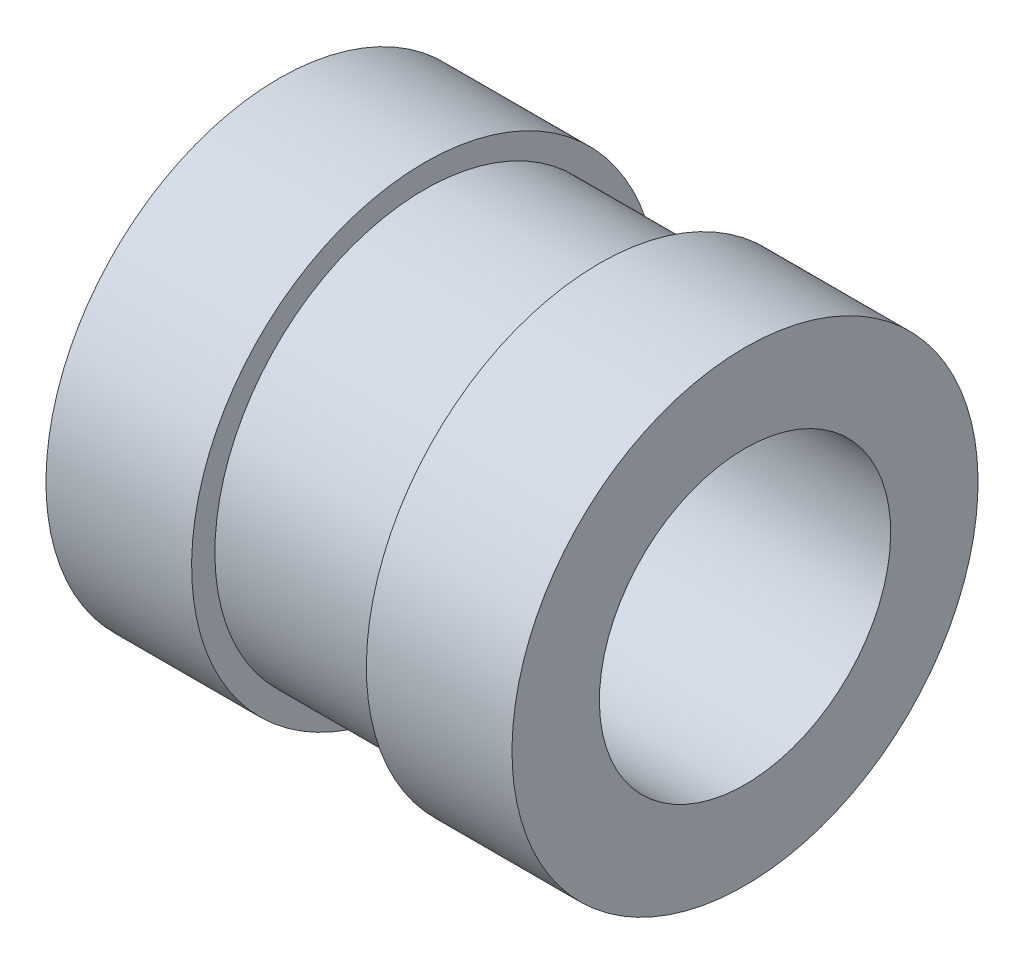
ISO-10303-21;
HEADER;
FILE_DESCRIPTION(('STEP AP214'),'2;1');
FILE_NAME('part.step','',(''),(''),'','','');
FILE_SCHEMA(('AUTOMOTIVE_DESIGN { 1 0 10303 214 1 1 1 1 }'));
ENDSEC;
DATA;
#1=APPLICATION_CONTEXT('core data for automotive mechanical design processes');
#2=APPLICATION_PROTOCOL_DEFINITION('international standard','automotive_design',2000,#1);
#3=PRODUCT_CONTEXT('',#1,'mechanical');
#4=PRODUCT('Part','Part','',(#3));
#5=PRODUCT_RELATED_PRODUCT_CATEGORY('part','',(#4));
#6=PRODUCT_DEFINITION_FORMATION('','',#4);
#7=PRODUCT_DEFINITION_CONTEXT('part definition',#1,'design');
#8=PRODUCT_DEFINITION('design','',#6,#7);
#9=PRODUCT_DEFINITION_SHAPE('','',#8);
#10=(LENGTH_UNIT() NAMED_UNIT(*) SI_UNIT(.MILLI.,.METRE.));
#11=(NAMED_UNIT(*) PLANE_ANGLE_UNIT() SI_UNIT($,.RADIAN.));
#12=(NAMED_UNIT(*) SI_UNIT($,.STERADIAN.) SOLID_ANGLE_UNIT());
#13=UNCERTAINTY_MEASURE_WITH_UNIT(LENGTH_MEASURE(1.E-05),#10,'distance_accuracy_value','');
#14=(GEOMETRIC_REPRESENTATION_CONTEXT(3) GLOBAL_UNCERTAINTY_ASSIGNED_CONTEXT((#13)) GLOBAL_UNIT_ASSIGNED_CONTEXT((#10,
#11,#12)) REPRESENTATION_CONTEXT('',''));
#15=CARTESIAN_POINT('',(0.,0.,0.));
#16=DIRECTION('',(0.,0.,1.));
#17=DIRECTION('',(1.,0.,0.));
#18=AXIS2_PLACEMENT_3D('',#15,#16,#17);
#19=CARTESIAN_POINT('',(9.62704679735164,39.9670130886636,125.728955153829));
#20=DIRECTION('',(-1.,0.,0.));
#21=DIRECTION('',(0.,-1.,0.));
#22=AXIS2_PLACEMENT_3D('',#19,#20,#21);
#23=CYLINDRICAL_SURFACE('',#22,1.8);
#24=CARTESIAN_POINT('',(12.3770467973516,39.9670130886636,125.728955153829));
#25=DIRECTION('',(-1.,0.,0.));
#26=DIRECTION('',(0.,-1.,0.));
#27=AXIS2_PLACEMENT_3D('',#24,#25,#26);
#28=CIRCLE('',#27,1.8);
#29=CARTESIAN_POINT('',(12.3770467973516,38.1670130886637,125.728955153829));
#30=VERTEX_POINT('',#29);
#31=EDGE_CURVE('E18',#30,#30,#28,.T.);
#32=ORIENTED_EDGE('',*,*,#31,.T.);
#33=EDGE_LOOP('',(#32));
#34=FACE_BOUND('',#33,.T.);
#35=CARTESIAN_POINT('',(10.8770467973516,39.9670130886636,125.728955153829));
#36=DIRECTION('',(-1.,0.,0.));
#37=DIRECTION('',(0.,-1.,0.));
#38=AXIS2_PLACEMENT_3D('',#35,#36,#37);
#39=CIRCLE('',#38,1.8);
#40=CARTESIAN_POINT('',(10.8770467973516,38.1670130886637,125.728955153829));
#41=VERTEX_POINT('',#40);
#42=EDGE_CURVE('E40',#41,#41,#39,.F.);
#43=ORIENTED_EDGE('',*,*,#42,.T.);
#44=EDGE_LOOP('',(#43));
#45=FACE_BOUND('',#44,.T.);
#46=ADVANCED_FACE('F15',(#34,#45),#23,.T.);
#47=CARTESIAN_POINT('',(12.3770467973516,37.9670130886636,125.728955153829));
#48=DIRECTION('',(1.,0.,0.));
#49=DIRECTION('',(0.,1.,0.));
#50=AXIS2_PLACEMENT_3D('',#47,#48,#49);
#51=PLANE('',#50);
#52=ORIENTED_EDGE('',*,*,#31,.F.);
#53=EDGE_LOOP('',(#52));
#54=FACE_BOUND('',#53,.T.);
#55=CARTESIAN_POINT('',(12.3770467973516,39.9670130886636,125.728955153829));
#56=DIRECTION('',(1.,0.,0.));
#57=DIRECTION('',(0.,1.,0.));
#58=AXIS2_PLACEMENT_3D('',#55,#56,#57);
#59=CIRCLE('',#58,2.);
#60=CARTESIAN_POINT('',(12.3770467973516,41.9670130886636,125.728955153829));
#61=VERTEX_POINT('',#60);
#62=EDGE_CURVE('E38',#61,#61,#59,.T.);
#63=ORIENTED_EDGE('',*,*,#62,.F.);
#64=EDGE_LOOP('',(#63));
#65=FACE_BOUND('',#64,.T.);
#66=ADVANCED_FACE('F48',(#54,#65),#51,.F.);
#67=CARTESIAN_POINT('',(10.8770467973516,37.9670130886636,125.728955153829));
#68=DIRECTION('',(-1.,0.,0.));
#69=DIRECTION('',(0.,-1.,0.));
#70=AXIS2_PLACEMENT_3D('',#67,#68,#69);
#71=PLANE('',#70);
#72=CARTESIAN_POINT('',(10.8770467973516,39.9670130886636,125.728955153829));
#73=DIRECTION('',(1.,0.,0.));
#74=DIRECTION('',(0.,1.,0.));
#75=AXIS2_PLACEMENT_3D('',#72,#73,#74);
#76=CIRCLE('',#75,2.);
#77=CARTESIAN_POINT('',(10.8770467973516,41.9670130886636,125.728955153829));
#78=VERTEX_POINT('',#77);
#79=EDGE_CURVE('E35',#78,#78,#76,.F.);
#80=ORIENTED_EDGE('',*,*,#79,.F.);
#81=EDGE_LOOP('',(#80));
#82=FACE_BOUND('',#81,.T.);
#83=ORIENTED_EDGE('',*,*,#42,.F.);
#84=EDGE_LOOP('',(#83));
#85=FACE_BOUND('',#84,.T.);
#86=ADVANCED_FACE('F51',(#82,#85),#71,.F.);
#87=CARTESIAN_POINT('',(9.62704679735164,39.9670130886636,125.728955153829));
#88=DIRECTION('',(1.,0.,0.));
#89=DIRECTION('',(0.,1.,0.));
#90=AXIS2_PLACEMENT_3D('',#87,#88,#89);
#91=CYLINDRICAL_SURFACE('',#90,2.);
#92=ORIENTED_EDGE('',*,*,#62,.T.);
#93=EDGE_LOOP('',(#92));
#94=FACE_BOUND('',#93,.T.);
#95=CARTESIAN_POINT('',(13.6270467973516,39.9670130886636,125.728955153829));
#96=DIRECTION('',(1.,0.,0.));
#97=DIRECTION('',(0.,1.,0.));
#98=AXIS2_PLACEMENT_3D('',#95,#96,#97);
#99=CIRCLE('',#98,2.);
#100=CARTESIAN_POINT('',(13.6270467973516,41.9670130886636,125.728955153829));
#101=VERTEX_POINT('',#100);
#102=EDGE_CURVE('E32',#101,#101,#99,.F.);
#103=ORIENTED_EDGE('',*,*,#102,.T.);
#104=EDGE_LOOP('',(#103));
#105=FACE_BOUND('',#104,.T.);
#106=ADVANCED_FACE('F54',(#94,#105),#91,.T.);
#107=CARTESIAN_POINT('',(9.62704679735164,39.9670130886636,125.728955153829));
#108=DIRECTION('',(1.,0.,0.));
#109=DIRECTION('',(0.,1.,0.));
#110=AXIS2_PLACEMENT_3D('',#107,#108,#109);
#111=CYLINDRICAL_SURFACE('',#110,2.);
#112=ORIENTED_EDGE('',*,*,#79,.T.);
#113=EDGE_LOOP('',(#112));
#114=FACE_BOUND('',#113,.T.);
#115=CARTESIAN_POINT('',(9.62704679735164,39.9670130886636,125.728955153829));
#116=DIRECTION('',(1.,0.,0.));
#117=DIRECTION('',(0.,1.,0.));
#118=AXIS2_PLACEMENT_3D('',#115,#116,#117);
#119=CIRCLE('',#118,2.);
#120=CARTESIAN_POINT('',(9.62704679735164,41.9670130886636,125.728955153829));
#121=VERTEX_POINT('',#120);
#122=EDGE_CURVE('E27',#121,#121,#119,.F.);
#123=ORIENTED_EDGE('',*,*,#122,.F.);
#124=EDGE_LOOP('',(#123));
#125=FACE_BOUND('',#124,.T.);
#126=ADVANCED_FACE('F57',(#114,#125),#111,.T.);
#127=CARTESIAN_POINT('',(13.6270467973516,39.9670130886636,125.728955153829));
#128=DIRECTION('',(-1.,0.,0.));
#129=DIRECTION('',(0.,-1.,0.));
#130=AXIS2_PLACEMENT_3D('',#127,#128,#129);
#131=PLANE('',#130);
#132=ORIENTED_EDGE('',*,*,#102,.F.);
#133=EDGE_LOOP('',(#132));
#134=FACE_BOUND('',#133,.T.);
#135=CARTESIAN_POINT('',(13.6270467973516,39.9670130886636,125.728955153829));
#136=DIRECTION('',(1.,0.,0.));
#137=DIRECTION('',(0.,1.,0.));
#138=AXIS2_PLACEMENT_3D('',#135,#136,#137);
#139=CIRCLE('',#138,1.25);
#140=CARTESIAN_POINT('',(13.6270467973516,41.2170130886636,125.728955153829));
#141=VERTEX_POINT('',#140);
#142=EDGE_CURVE('E22',#141,#141,#139,.F.);
#143=ORIENTED_EDGE('',*,*,#142,.T.);
#144=EDGE_LOOP('',(#143));
#145=FACE_BOUND('',#144,.T.);
#146=ADVANCED_FACE('F61',(#134,#145),#131,.F.);
#147=CARTESIAN_POINT('',(9.62704679735164,39.9670130886636,125.728955153829));
#148=DIRECTION('',(-1.,0.,0.));
#149=DIRECTION('',(0.,-1.,0.));
#150=AXIS2_PLACEMENT_3D('',#147,#148,#149);
#151=PLANE('',#150);
#152=ORIENTED_EDGE('',*,*,#122,.T.);
#153=EDGE_LOOP('',(#152));
#154=FACE_BOUND('',#153,.T.);
#155=CARTESIAN_POINT('',(9.62704679735164,39.9670130886636,125.728955153829));
#156=DIRECTION('',(1.,0.,0.));
#157=DIRECTION('',(0.,1.,0.));
#158=AXIS2_PLACEMENT_3D('',#155,#156,#157);
#159=CIRCLE('',#158,1.25);
#160=CARTESIAN_POINT('',(9.62704679735164,41.2170130886636,125.728955153829));
#161=VERTEX_POINT('',#160);
#162=EDGE_CURVE('E10',#161,#161,#159,.T.);
#163=ORIENTED_EDGE('',*,*,#162,.T.);
#164=EDGE_LOOP('',(#163));
#165=FACE_BOUND('',#164,.T.);
#166=ADVANCED_FACE('F64',(#154,#165),#151,.T.);
#167=CARTESIAN_POINT('',(9.62704679735164,39.9670130886636,125.728955153829));
#168=DIRECTION('',(1.,0.,0.));
#169=DIRECTION('',(0.,1.,0.));
#170=AXIS2_PLACEMENT_3D('',#167,#168,#169);
#171=CYLINDRICAL_SURFACE('',#170,1.25);
#172=ORIENTED_EDGE('',*,*,#162,.F.);
#173=EDGE_LOOP('',(#172));
#174=FACE_BOUND('',#173,.T.);
#175=ORIENTED_EDGE('',*,*,#142,.F.);
#176=EDGE_LOOP('',(#175));
#177=FACE_BOUND('',#176,.T.);
#178=ADVANCED_FACE('F68',(#174,#177),#171,.F.);
#179=CLOSED_SHELL('',(#46,#66,#86,#106,#126,#146,#166,#178));
#180=MANIFOLD_SOLID_BREP('B1',#179);
#181=ADVANCED_BREP_SHAPE_REPRESENTATION('',(#18,#180),#14);
#182=SHAPE_DEFINITION_REPRESENTATION(#9,#181);
ENDSEC;
END-ISO-10303-21;
